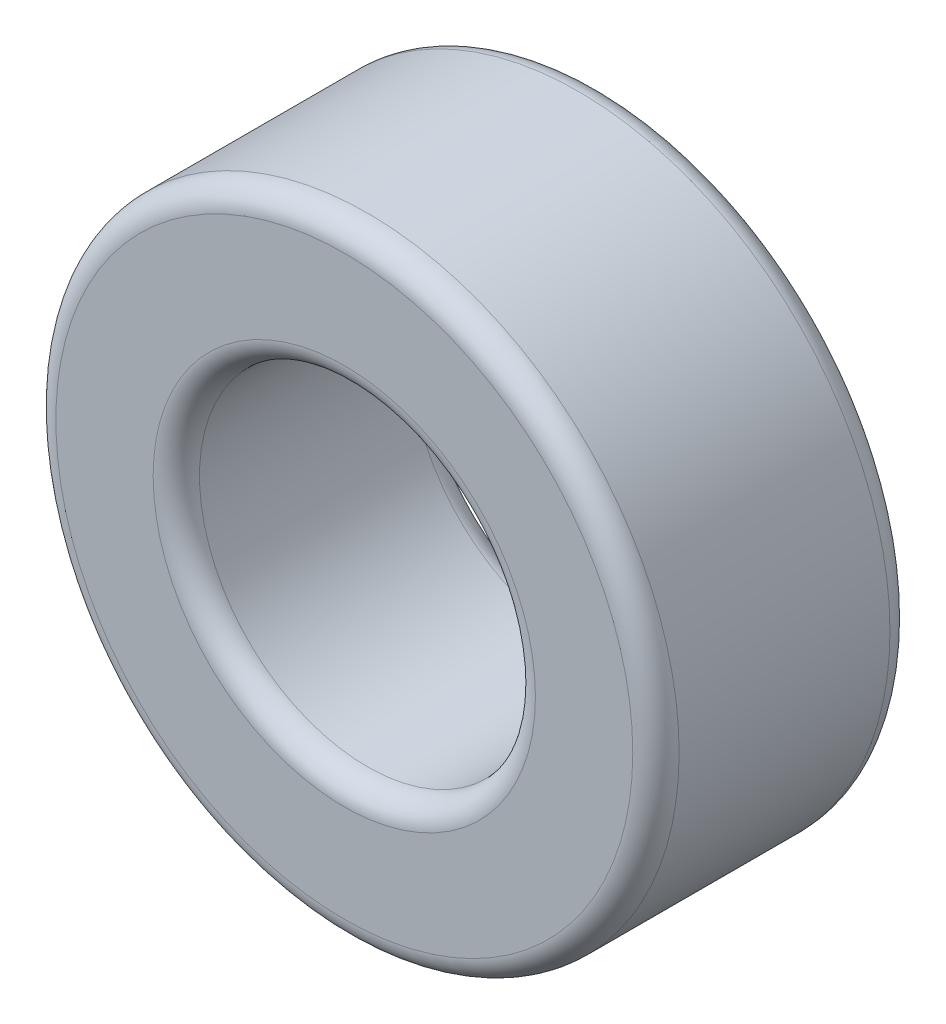
ISO-10303-21;
HEADER;
FILE_DESCRIPTION(('STEP AP214'),'2;1');
FILE_NAME('part.step','',(''),(''),'','','');
FILE_SCHEMA(('AUTOMOTIVE_DESIGN { 1 0 10303 214 1 1 1 1 }'));
ENDSEC;
DATA;
#1=APPLICATION_CONTEXT('core data for automotive mechanical design processes');
#2=APPLICATION_PROTOCOL_DEFINITION('international standard','automotive_design',2000,#1);
#3=PRODUCT_CONTEXT('',#1,'mechanical');
#4=PRODUCT('Part','Part','',(#3));
#5=PRODUCT_RELATED_PRODUCT_CATEGORY('part','',(#4));
#6=PRODUCT_DEFINITION_FORMATION('','',#4);
#7=PRODUCT_DEFINITION_CONTEXT('part definition',#1,'design');
#8=PRODUCT_DEFINITION('design','',#6,#7);
#9=PRODUCT_DEFINITION_SHAPE('','',#8);
#10=(LENGTH_UNIT() NAMED_UNIT(*) SI_UNIT(.MILLI.,.METRE.));
#11=(NAMED_UNIT(*) PLANE_ANGLE_UNIT() SI_UNIT($,.RADIAN.));
#12=(NAMED_UNIT(*) SI_UNIT($,.STERADIAN.) SOLID_ANGLE_UNIT());
#13=UNCERTAINTY_MEASURE_WITH_UNIT(LENGTH_MEASURE(1.E-05),#10,'distance_accuracy_value','');
#14=(GEOMETRIC_REPRESENTATION_CONTEXT(3) GLOBAL_UNCERTAINTY_ASSIGNED_CONTEXT((#13)) GLOBAL_UNIT_ASSIGNED_CONTEXT((#10,
#11,#12)) REPRESENTATION_CONTEXT('',''));
#15=CARTESIAN_POINT('',(0.,0.,0.));
#16=DIRECTION('',(0.,0.,1.));
#17=DIRECTION('',(1.,0.,0.));
#18=AXIS2_PLACEMENT_3D('',#15,#16,#17);
#19=CARTESIAN_POINT('',(0.,0.,11.1));
#20=DIRECTION('',(0.,0.,1.));
#21=DIRECTION('',(1.,0.,0.));
#22=AXIS2_PLACEMENT_3D('',#19,#20,#21);
#23=PLANE('',#22);
#24=CARTESIAN_POINT('',(0.,0.,11.1));
#25=DIRECTION('',(0.,0.,1.));
#26=DIRECTION('',(1.,0.,0.));
#27=AXIS2_PLACEMENT_3D('',#24,#25,#26);
#28=CIRCLE('',#27,8.25);
#29=CARTESIAN_POINT('',(8.25,0.,11.1));
#30=VERTEX_POINT('',#29);
#31=EDGE_CURVE('E52',#30,#30,#28,.F.);
#32=ORIENTED_EDGE('',*,*,#31,.T.);
#33=EDGE_LOOP('',(#32));
#34=FACE_BOUND('',#33,.T.);
#35=CARTESIAN_POINT('',(0.,0.,11.1));
#36=DIRECTION('',(0.,0.,1.));
#37=DIRECTION('',(1.,0.,0.));
#38=AXIS2_PLACEMENT_3D('',#35,#36,#37);
#39=CIRCLE('',#38,12.45);
#40=CARTESIAN_POINT('',(12.45,0.,11.1));
#41=VERTEX_POINT('',#40);
#42=EDGE_CURVE('E57',#41,#41,#39,.T.);
#43=ORIENTED_EDGE('',*,*,#42,.T.);
#44=EDGE_LOOP('',(#43));
#45=FACE_BOUND('',#44,.T.);
#46=ADVANCED_FACE('F39',(#34,#45),#23,.T.);
#47=CARTESIAN_POINT('',(0.,0.,0.));
#48=DIRECTION('',(0.,0.,1.));
#49=DIRECTION('',(1.,0.,0.));
#50=AXIS2_PLACEMENT_3D('',#47,#48,#49);
#51=PLANE('',#50);
#52=CARTESIAN_POINT('',(0.,0.,0.));
#53=DIRECTION('',(0.,0.,1.));
#54=DIRECTION('',(1.,0.,0.));
#55=AXIS2_PLACEMENT_3D('',#52,#53,#54);
#56=CIRCLE('',#55,8.25);
#57=CARTESIAN_POINT('',(8.25,0.,0.));
#58=VERTEX_POINT('',#57);
#59=EDGE_CURVE('E71',#58,#58,#56,.T.);
#60=ORIENTED_EDGE('',*,*,#59,.T.);
#61=EDGE_LOOP('',(#60));
#62=FACE_BOUND('',#61,.T.);
#63=CARTESIAN_POINT('',(0.,0.,0.));
#64=DIRECTION('',(0.,0.,1.));
#65=DIRECTION('',(1.,0.,0.));
#66=AXIS2_PLACEMENT_3D('',#63,#64,#65);
#67=CIRCLE('',#66,12.45);
#68=CARTESIAN_POINT('',(12.45,0.,0.));
#69=VERTEX_POINT('',#68);
#70=EDGE_CURVE('E75',#69,#69,#67,.F.);
#71=ORIENTED_EDGE('',*,*,#70,.T.);
#72=EDGE_LOOP('',(#71));
#73=FACE_BOUND('',#72,.T.);
#74=ADVANCED_FACE('F80',(#62,#73),#51,.F.);
#75=CARTESIAN_POINT('',(0.,0.,11.1));
#76=DIRECTION('',(0.,0.,-1.));
#77=DIRECTION('',(-1.,0.,0.));
#78=AXIS2_PLACEMENT_3D('',#75,#76,#77);
#79=CYLINDRICAL_SURFACE('',#78,13.45);
#80=CARTESIAN_POINT('',(0.,0.,0.999999999999999));
#81=DIRECTION('',(0.,0.,1.));
#82=DIRECTION('',(1.,0.,0.));
#83=AXIS2_PLACEMENT_3D('',#80,#81,#82);
#84=CIRCLE('',#83,13.45);
#85=CARTESIAN_POINT('',(13.45,0.,0.999999999999999));
#86=VERTEX_POINT('',#85);
#87=EDGE_CURVE('E10',#86,#86,#84,.T.);
#88=ORIENTED_EDGE('',*,*,#87,.T.);
#89=EDGE_LOOP('',(#88));
#90=FACE_BOUND('',#89,.T.);
#91=CARTESIAN_POINT('',(0.,0.,10.1));
#92=DIRECTION('',(0.,0.,1.));
#93=DIRECTION('',(1.,0.,0.));
#94=AXIS2_PLACEMENT_3D('',#91,#92,#93);
#95=CIRCLE('',#94,13.45);
#96=CARTESIAN_POINT('',(13.45,0.,10.1));
#97=VERTEX_POINT('',#96);
#98=EDGE_CURVE('E47',#97,#97,#95,.F.);
#99=ORIENTED_EDGE('',*,*,#98,.T.);
#100=EDGE_LOOP('',(#99));
#101=FACE_BOUND('',#100,.T.);
#102=ADVANCED_FACE('F100',(#90,#101),#79,.T.);
#103=CARTESIAN_POINT('',(0.,0.,11.1));
#104=DIRECTION('',(0.,0.,-1.));
#105=DIRECTION('',(-1.,0.,0.));
#106=AXIS2_PLACEMENT_3D('',#103,#104,#105);
#107=CYLINDRICAL_SURFACE('',#106,7.25);
#108=CARTESIAN_POINT('',(0.,0.,0.999999999999999));
#109=DIRECTION('',(0.,0.,1.));
#110=DIRECTION('',(1.,0.,0.));
#111=AXIS2_PLACEMENT_3D('',#108,#109,#110);
#112=CIRCLE('',#111,7.25);
#113=CARTESIAN_POINT('',(7.25,0.,0.999999999999999));
#114=VERTEX_POINT('',#113);
#115=EDGE_CURVE('E63',#114,#114,#112,.F.);
#116=ORIENTED_EDGE('',*,*,#115,.T.);
#117=EDGE_LOOP('',(#116));
#118=FACE_BOUND('',#117,.T.);
#119=CARTESIAN_POINT('',(0.,0.,10.1));
#120=DIRECTION('',(0.,0.,1.));
#121=DIRECTION('',(1.,0.,0.));
#122=AXIS2_PLACEMENT_3D('',#119,#120,#121);
#123=CIRCLE('',#122,7.25);
#124=CARTESIAN_POINT('',(7.25,0.,10.1));
#125=VERTEX_POINT('',#124);
#126=EDGE_CURVE('E67',#125,#125,#123,.T.);
#127=ORIENTED_EDGE('',*,*,#126,.T.);
#128=EDGE_LOOP('',(#127));
#129=FACE_BOUND('',#128,.T.);
#130=ADVANCED_FACE('F105',(#118,#129),#107,.F.);
#131=CARTESIAN_POINT('',(0.,0.,0.999999999999999));
#132=DIRECTION('',(0.,0.,1.));
#133=DIRECTION('',(1.,0.,0.));
#134=AXIS2_PLACEMENT_3D('',#131,#132,#133);
#135=TOROIDAL_SURFACE('',#134,8.25,1.);
#136=ORIENTED_EDGE('',*,*,#115,.F.);
#137=EDGE_LOOP('',(#136));
#138=FACE_BOUND('',#137,.T.);
#139=ORIENTED_EDGE('',*,*,#59,.F.);
#140=EDGE_LOOP('',(#139));
#141=FACE_BOUND('',#140,.T.);
#142=ADVANCED_FACE('F91',(#138,#141),#135,.T.);
#143=CARTESIAN_POINT('',(0.,0.,10.1));
#144=DIRECTION('',(0.,0.,1.));
#145=DIRECTION('',(1.,0.,0.));
#146=AXIS2_PLACEMENT_3D('',#143,#144,#145);
#147=TOROIDAL_SURFACE('',#146,8.25,1.);
#148=ORIENTED_EDGE('',*,*,#31,.F.);
#149=EDGE_LOOP('',(#148));
#150=FACE_BOUND('',#149,.T.);
#151=ORIENTED_EDGE('',*,*,#126,.F.);
#152=EDGE_LOOP('',(#151));
#153=FACE_BOUND('',#152,.T.);
#154=ADVANCED_FACE('F85',(#150,#153),#147,.T.);
#155=CARTESIAN_POINT('',(0.,0.,0.999999999999999));
#156=DIRECTION('',(0.,0.,1.));
#157=DIRECTION('',(1.,0.,0.));
#158=AXIS2_PLACEMENT_3D('',#155,#156,#157);
#159=TOROIDAL_SURFACE('',#158,12.45,1.);
#160=ORIENTED_EDGE('',*,*,#70,.F.);
#161=EDGE_LOOP('',(#160));
#162=FACE_BOUND('',#161,.T.);
#163=ORIENTED_EDGE('',*,*,#87,.F.);
#164=EDGE_LOOP('',(#163));
#165=FACE_BOUND('',#164,.T.);
#166=ADVANCED_FACE('F82',(#162,#165),#159,.T.);
#167=CARTESIAN_POINT('',(0.,0.,10.1));
#168=DIRECTION('',(0.,0.,1.));
#169=DIRECTION('',(1.,0.,0.));
#170=AXIS2_PLACEMENT_3D('',#167,#168,#169);
#171=TOROIDAL_SURFACE('',#170,12.45,1.);
#172=ORIENTED_EDGE('',*,*,#98,.F.);
#173=EDGE_LOOP('',(#172));
#174=FACE_BOUND('',#173,.T.);
#175=ORIENTED_EDGE('',*,*,#42,.F.);
#176=EDGE_LOOP('',(#175));
#177=FACE_BOUND('',#176,.T.);
#178=ADVANCED_FACE('F41',(#174,#177),#171,.T.);
#179=CLOSED_SHELL('',(#46,#74,#102,#130,#142,#154,#166,#178));
#180=MANIFOLD_SOLID_BREP('B2',#179);
#181=ADVANCED_BREP_SHAPE_REPRESENTATION('',(#18,#180),#14);
#182=SHAPE_DEFINITION_REPRESENTATION(#9,#181);
ENDSEC;
END-ISO-10303-21;
